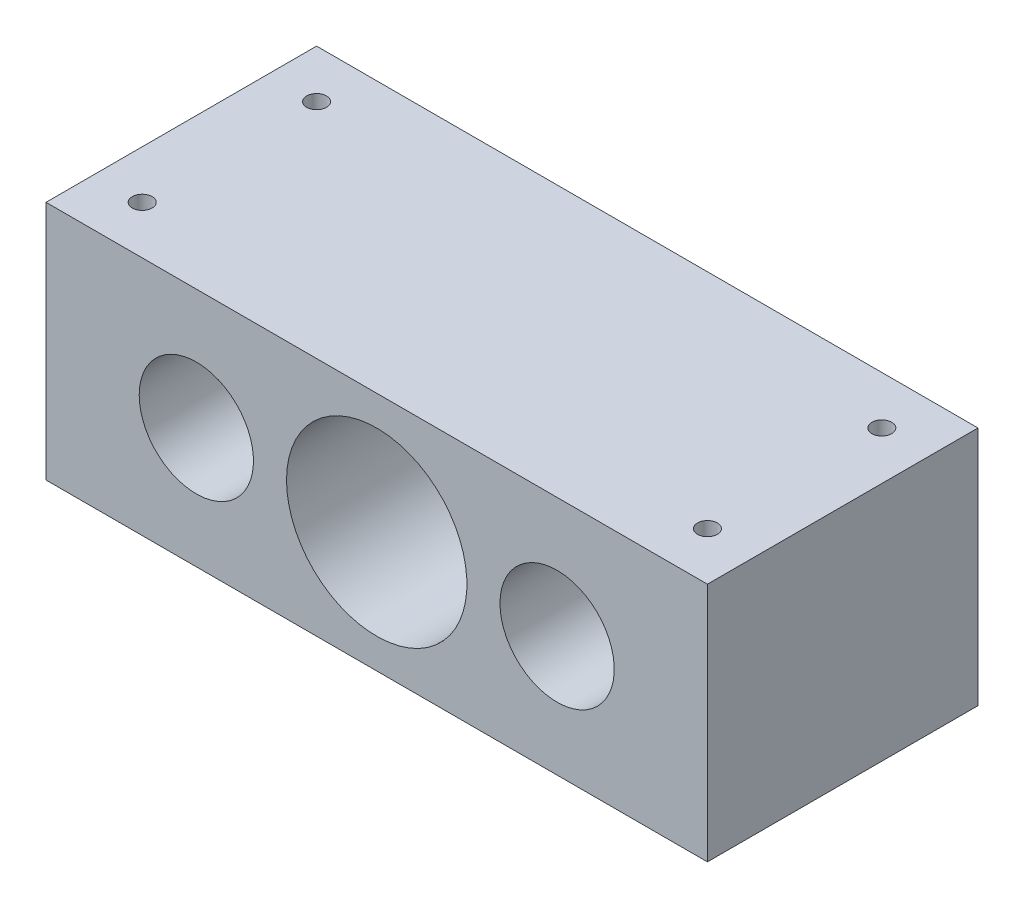
ISO-10303-21;
HEADER;
FILE_DESCRIPTION(('STEP AP214'),'2;1');
FILE_NAME('part.step','',(''),(''),'','','');
FILE_SCHEMA(('AUTOMOTIVE_DESIGN { 1 0 10303 214 1 1 1 1 }'));
ENDSEC;
DATA;
#1=APPLICATION_CONTEXT('core data for automotive mechanical design processes');
#2=APPLICATION_PROTOCOL_DEFINITION('international standard','automotive_design',2000,#1);
#3=PRODUCT_CONTEXT('',#1,'mechanical');
#4=PRODUCT('Part','Part','',(#3));
#5=PRODUCT_RELATED_PRODUCT_CATEGORY('part','',(#4));
#6=PRODUCT_DEFINITION_FORMATION('','',#4);
#7=PRODUCT_DEFINITION_CONTEXT('part definition',#1,'design');
#8=PRODUCT_DEFINITION('design','',#6,#7);
#9=PRODUCT_DEFINITION_SHAPE('','',#8);
#10=(LENGTH_UNIT() NAMED_UNIT(*) SI_UNIT(.MILLI.,.METRE.));
#11=(NAMED_UNIT(*) PLANE_ANGLE_UNIT() SI_UNIT($,.RADIAN.));
#12=(NAMED_UNIT(*) SI_UNIT($,.STERADIAN.) SOLID_ANGLE_UNIT());
#13=UNCERTAINTY_MEASURE_WITH_UNIT(LENGTH_MEASURE(1.E-05),#10,'distance_accuracy_value','');
#14=(GEOMETRIC_REPRESENTATION_CONTEXT(3) GLOBAL_UNCERTAINTY_ASSIGNED_CONTEXT((#13)) GLOBAL_UNIT_ASSIGNED_CONTEXT((#10,
#11,#12)) REPRESENTATION_CONTEXT('',''));
#15=CARTESIAN_POINT('',(0.,0.,0.));
#16=DIRECTION('',(0.,0.,1.));
#17=DIRECTION('',(1.,0.,0.));
#18=AXIS2_PLACEMENT_3D('',#15,#16,#17);
#19=CARTESIAN_POINT('',(0.,0.,22.5));
#20=DIRECTION('',(0.,1.,0.));
#21=DIRECTION('',(0.,0.,1.));
#22=AXIS2_PLACEMENT_3D('',#19,#20,#21);
#23=PLANE('',#22);
#24=DIRECTION('',(1.,0.,0.));
#25=VECTOR('',#24,1.);
#26=CARTESIAN_POINT('',(0.,0.,-22.5));
#27=LINE('',#26,#25);
#28=CARTESIAN_POINT('',(-55.,0.,-22.5));
#29=VERTEX_POINT('',#28);
#30=CARTESIAN_POINT('',(55.,0.,-22.5));
#31=VERTEX_POINT('',#30);
#32=EDGE_CURVE('E200',#29,#31,#27,.T.);
#33=ORIENTED_EDGE('',*,*,#32,.T.);
#34=DIRECTION('',(0.,0.,-1.));
#35=VECTOR('',#34,1.);
#36=CARTESIAN_POINT('',(55.,0.,22.5));
#37=LINE('',#36,#35);
#38=CARTESIAN_POINT('',(55.,0.,22.5));
#39=VERTEX_POINT('',#38);
#40=EDGE_CURVE('E13',#39,#31,#37,.T.);
#41=ORIENTED_EDGE('',*,*,#40,.F.);
#42=DIRECTION('',(1.,0.,0.));
#43=VECTOR('',#42,1.);
#44=CARTESIAN_POINT('',(0.,0.,22.5));
#45=LINE('',#44,#43);
#46=CARTESIAN_POINT('',(-55.,0.,22.5));
#47=VERTEX_POINT('',#46);
#48=EDGE_CURVE('E92',#47,#39,#45,.T.);
#49=ORIENTED_EDGE('',*,*,#48,.F.);
#50=DIRECTION('',(0.,0.,-1.));
#51=VECTOR('',#50,1.);
#52=CARTESIAN_POINT('',(-55.,0.,22.5));
#53=LINE('',#52,#51);
#54=EDGE_CURVE('E194',#47,#29,#53,.T.);
#55=ORIENTED_EDGE('',*,*,#54,.T.);
#56=EDGE_LOOP('',(#33,#41,#49,#55));
#57=FACE_BOUND('',#56,.T.);
#58=ADVANCED_FACE('F48',(#57),#23,.F.);
#59=CARTESIAN_POINT('',(55.,0.,22.5));
#60=DIRECTION('',(1.,0.,0.));
#61=DIRECTION('',(0.,0.,-1.));
#62=AXIS2_PLACEMENT_3D('',#59,#60,#61);
#63=PLANE('',#62);
#64=DIRECTION('',(0.,-1.,0.));
#65=VECTOR('',#64,1.);
#66=CARTESIAN_POINT('',(55.,0.,-22.5));
#67=LINE('',#66,#65);
#68=CARTESIAN_POINT('',(55.,40.,-22.5));
#69=VERTEX_POINT('',#68);
#70=EDGE_CURVE('E203',#69,#31,#67,.T.);
#71=ORIENTED_EDGE('',*,*,#70,.F.);
#72=DIRECTION('',(0.,0.,-1.));
#73=VECTOR('',#72,1.);
#74=CARTESIAN_POINT('',(55.,40.,22.5));
#75=LINE('',#74,#73);
#76=CARTESIAN_POINT('',(55.,40.,22.5));
#77=VERTEX_POINT('',#76);
#78=EDGE_CURVE('E57',#77,#69,#75,.T.);
#79=ORIENTED_EDGE('',*,*,#78,.F.);
#80=DIRECTION('',(0.,-1.,0.));
#81=VECTOR('',#80,1.);
#82=CARTESIAN_POINT('',(55.,0.,22.5));
#83=LINE('',#82,#81);
#84=EDGE_CURVE('E185',#77,#39,#83,.T.);
#85=ORIENTED_EDGE('',*,*,#84,.T.);
#86=ORIENTED_EDGE('',*,*,#40,.T.);
#87=EDGE_LOOP('',(#71,#79,#85,#86));
#88=FACE_BOUND('',#87,.T.);
#89=ADVANCED_FACE('F220',(#88),#63,.T.);
#90=CARTESIAN_POINT('',(0.,40.,22.5));
#91=DIRECTION('',(0.,-1.,0.));
#92=DIRECTION('',(0.,0.,-1.));
#93=AXIS2_PLACEMENT_3D('',#90,#91,#92);
#94=PLANE('',#93);
#95=CARTESIAN_POINT('',(47.,40.,-14.5));
#96=DIRECTION('',(0.,1.,0.));
#97=DIRECTION('',(0.,0.,1.));
#98=AXIS2_PLACEMENT_3D('',#95,#96,#97);
#99=CIRCLE('',#98,1.65);
#100=CARTESIAN_POINT('',(47.,40.,-12.85));
#101=VERTEX_POINT('',#100);
#102=EDGE_CURVE('E130',#101,#101,#99,.T.);
#103=ORIENTED_EDGE('',*,*,#102,.F.);
#104=EDGE_LOOP('',(#103));
#105=FACE_BOUND('',#104,.T.);
#106=CARTESIAN_POINT('',(-47.,40.,-14.4999999999993));
#107=DIRECTION('',(0.,1.,0.));
#108=DIRECTION('',(0.,0.,1.));
#109=AXIS2_PLACEMENT_3D('',#106,#107,#108);
#110=CIRCLE('',#109,1.65);
#111=CARTESIAN_POINT('',(-47.,40.,-12.8499999999993));
#112=VERTEX_POINT('',#111);
#113=EDGE_CURVE('E129',#112,#112,#110,.T.);
#114=ORIENTED_EDGE('',*,*,#113,.F.);
#115=EDGE_LOOP('',(#114));
#116=FACE_BOUND('',#115,.T.);
#117=CARTESIAN_POINT('',(-46.9999999999997,40.,14.5000000000007));
#118=DIRECTION('',(0.,1.,0.));
#119=DIRECTION('',(0.,0.,1.));
#120=AXIS2_PLACEMENT_3D('',#117,#118,#119);
#121=CIRCLE('',#120,1.65);
#122=CARTESIAN_POINT('',(-46.9999999999997,40.,16.1500000000007));
#123=VERTEX_POINT('',#122);
#124=EDGE_CURVE('E140',#123,#123,#121,.T.);
#125=ORIENTED_EDGE('',*,*,#124,.F.);
#126=EDGE_LOOP('',(#125));
#127=FACE_BOUND('',#126,.T.);
#128=CARTESIAN_POINT('',(47.0000000000003,40.,14.5));
#129=DIRECTION('',(0.,1.,0.));
#130=DIRECTION('',(0.,0.,1.));
#131=AXIS2_PLACEMENT_3D('',#128,#129,#130);
#132=CIRCLE('',#131,1.65);
#133=CARTESIAN_POINT('',(47.0000000000003,40.,16.15));
#134=VERTEX_POINT('',#133);
#135=EDGE_CURVE('E146',#134,#134,#132,.T.);
#136=ORIENTED_EDGE('',*,*,#135,.F.);
#137=EDGE_LOOP('',(#136));
#138=FACE_BOUND('',#137,.T.);
#139=DIRECTION('',(-1.,0.,0.));
#140=VECTOR('',#139,1.);
#141=CARTESIAN_POINT('',(0.,40.,-22.5));
#142=LINE('',#141,#140);
#143=CARTESIAN_POINT('',(-55.,40.,-22.5));
#144=VERTEX_POINT('',#143);
#145=EDGE_CURVE('E81',#69,#144,#142,.T.);
#146=ORIENTED_EDGE('',*,*,#145,.T.);
#147=DIRECTION('',(0.,0.,-1.));
#148=VECTOR('',#147,1.);
#149=CARTESIAN_POINT('',(-55.,40.,22.5));
#150=LINE('',#149,#148);
#151=CARTESIAN_POINT('',(-55.,40.,22.5));
#152=VERTEX_POINT('',#151);
#153=EDGE_CURVE('E211',#152,#144,#150,.T.);
#154=ORIENTED_EDGE('',*,*,#153,.F.);
#155=DIRECTION('',(-1.,0.,0.));
#156=VECTOR('',#155,1.);
#157=CARTESIAN_POINT('',(0.,40.,22.5));
#158=LINE('',#157,#156);
#159=EDGE_CURVE('E188',#77,#152,#158,.T.);
#160=ORIENTED_EDGE('',*,*,#159,.F.);
#161=ORIENTED_EDGE('',*,*,#78,.T.);
#162=EDGE_LOOP('',(#146,#154,#160,#161));
#163=FACE_BOUND('',#162,.T.);
#164=ADVANCED_FACE('F213',(#105,#116,#127,#138,#163),#94,.F.);
#165=CARTESIAN_POINT('',(-55.,0.,22.5));
#166=DIRECTION('',(1.,0.,0.));
#167=DIRECTION('',(0.,0.,-1.));
#168=AXIS2_PLACEMENT_3D('',#165,#166,#167);
#169=PLANE('',#168);
#170=DIRECTION('',(0.,-1.,0.));
#171=VECTOR('',#170,1.);
#172=CARTESIAN_POINT('',(-55.,0.,-22.5));
#173=LINE('',#172,#171);
#174=EDGE_CURVE('E87',#144,#29,#173,.T.);
#175=ORIENTED_EDGE('',*,*,#174,.T.);
#176=ORIENTED_EDGE('',*,*,#54,.F.);
#177=DIRECTION('',(0.,-1.,0.));
#178=VECTOR('',#177,1.);
#179=CARTESIAN_POINT('',(-55.,0.,22.5));
#180=LINE('',#179,#178);
#181=EDGE_CURVE('E65',#152,#47,#180,.T.);
#182=ORIENTED_EDGE('',*,*,#181,.F.);
#183=ORIENTED_EDGE('',*,*,#153,.T.);
#184=EDGE_LOOP('',(#175,#176,#182,#183));
#185=FACE_BOUND('',#184,.T.);
#186=ADVANCED_FACE('F222',(#185),#169,.F.);
#187=CARTESIAN_POINT('',(-30.,20.,22.5));
#188=DIRECTION('',(0.,0.,-1.));
#189=DIRECTION('',(-1.,0.,0.));
#190=AXIS2_PLACEMENT_3D('',#187,#188,#189);
#191=CYLINDRICAL_SURFACE('',#190,9.5);
#192=CARTESIAN_POINT('',(-30.,20.,22.5));
#193=DIRECTION('',(0.,0.,1.));
#194=DIRECTION('',(1.,0.,0.));
#195=AXIS2_PLACEMENT_3D('',#192,#193,#194);
#196=CIRCLE('',#195,9.5);
#197=CARTESIAN_POINT('',(-39.5,20.,22.5));
#198=VERTEX_POINT('',#197);
#199=EDGE_CURVE('E180',#198,#198,#196,.T.);
#200=CARTESIAN_POINT('',(-30.,20.,-22.5));
#201=DIRECTION('',(0.,0.,1.));
#202=DIRECTION('',(1.,0.,0.));
#203=AXIS2_PLACEMENT_3D('',#200,#201,#202);
#204=CIRCLE('',#203,9.5);
#205=CARTESIAN_POINT('',(-39.5,20.,-22.5));
#206=VERTEX_POINT('',#205);
#207=EDGE_CURVE('E197',#206,#206,#204,.T.);
#208=CARTESIAN_POINT('',(-39.5,20.,22.5));
#209=CARTESIAN_POINT('',(-39.5,20.,22.03125));
#210=CARTESIAN_POINT('',(-39.5,20.,21.5625));
#211=CARTESIAN_POINT('',(-39.5,20.,20.625));
#212=CARTESIAN_POINT('',(-39.5,20.,20.15625));
#213=CARTESIAN_POINT('',(-39.5,20.,19.21875));
#214=CARTESIAN_POINT('',(-39.5,20.,18.75));
#215=CARTESIAN_POINT('',(-39.5,20.,17.8125));
#216=CARTESIAN_POINT('',(-39.5,20.,17.34375));
#217=CARTESIAN_POINT('',(-39.5,20.,16.40625));
#218=CARTESIAN_POINT('',(-39.5,20.,15.9375));
#219=CARTESIAN_POINT('',(-39.5,20.,15.));
#220=CARTESIAN_POINT('',(-39.5,20.,14.53125));
#221=CARTESIAN_POINT('',(-39.5,20.,13.59375));
#222=CARTESIAN_POINT('',(-39.5,20.,13.125));
#223=CARTESIAN_POINT('',(-39.5,20.,12.1875));
#224=CARTESIAN_POINT('',(-39.5,20.,11.71875));
#225=CARTESIAN_POINT('',(-39.5,20.,10.78125));
#226=CARTESIAN_POINT('',(-39.5,20.,10.3125));
#227=CARTESIAN_POINT('',(-39.5,20.,9.37499999999999));
#228=CARTESIAN_POINT('',(-39.5,20.,8.90625));
#229=CARTESIAN_POINT('',(-39.5,20.,7.96874999999999));
#230=CARTESIAN_POINT('',(-39.5,20.,7.5));
#231=CARTESIAN_POINT('',(-39.5,20.,6.5625));
#232=CARTESIAN_POINT('',(-39.5,20.,6.09375));
#233=CARTESIAN_POINT('',(-39.5,20.,5.15625));
#234=CARTESIAN_POINT('',(-39.5,20.,4.6875));
#235=CARTESIAN_POINT('',(-39.5,20.,3.75));
#236=CARTESIAN_POINT('',(-39.5,20.,3.28125));
#237=CARTESIAN_POINT('',(-39.5,20.,2.34375));
#238=CARTESIAN_POINT('',(-39.5,20.,1.875));
#239=CARTESIAN_POINT('',(-39.5,20.,0.937499999999997));
#240=CARTESIAN_POINT('',(-39.5,20.,0.468749999999997));
#241=CARTESIAN_POINT('',(-39.5,20.,-0.468750000000004));
#242=CARTESIAN_POINT('',(-39.5,20.,-0.937500000000004));
#243=CARTESIAN_POINT('',(-39.5,20.,-1.87500000000001));
#244=CARTESIAN_POINT('',(-39.5,20.,-2.34375000000001));
#245=CARTESIAN_POINT('',(-39.5,20.,-3.28125));
#246=CARTESIAN_POINT('',(-39.5,20.,-3.75));
#247=CARTESIAN_POINT('',(-39.5,20.,-4.6875));
#248=CARTESIAN_POINT('',(-39.5,20.,-5.15625));
#249=CARTESIAN_POINT('',(-39.5,20.,-6.09375000000001));
#250=CARTESIAN_POINT('',(-39.5,20.,-6.56250000000001));
#251=CARTESIAN_POINT('',(-39.5,20.,-7.50000000000001));
#252=CARTESIAN_POINT('',(-39.5,20.,-7.96875000000001));
#253=CARTESIAN_POINT('',(-39.5,20.,-8.90625));
#254=CARTESIAN_POINT('',(-39.5,20.,-9.37500000000001));
#255=CARTESIAN_POINT('',(-39.5,20.,-10.3125));
#256=CARTESIAN_POINT('',(-39.5,20.,-10.78125));
#257=CARTESIAN_POINT('',(-39.5,20.,-11.71875));
#258=CARTESIAN_POINT('',(-39.5,20.,-12.1875));
#259=CARTESIAN_POINT('',(-39.5,20.,-13.125));
#260=CARTESIAN_POINT('',(-39.5,20.,-13.59375));
#261=CARTESIAN_POINT('',(-39.5,20.,-14.53125));
#262=CARTESIAN_POINT('',(-39.5,20.,-15.));
#263=CARTESIAN_POINT('',(-39.5,20.,-15.9375));
#264=CARTESIAN_POINT('',(-39.5,20.,-16.40625));
#265=CARTESIAN_POINT('',(-39.5,20.,-17.34375));
#266=CARTESIAN_POINT('',(-39.5,20.,-17.8125));
#267=CARTESIAN_POINT('',(-39.5,20.,-18.75));
#268=CARTESIAN_POINT('',(-39.5,20.,-19.21875));
#269=CARTESIAN_POINT('',(-39.5,20.,-20.15625));
#270=CARTESIAN_POINT('',(-39.5,20.,-20.625));
#271=CARTESIAN_POINT('',(-39.5,20.,-21.5625));
#272=CARTESIAN_POINT('',(-39.5,20.,-22.03125));
#273=CARTESIAN_POINT('',(-39.5,20.,-22.5));
#274=B_SPLINE_CURVE_WITH_KNOTS('',3,(#208,#209,#210,#211,#212,#213,#214,#215,#216,#217,#218,
#219,#220,#221,#222,#223,#224,#225,#226,#227,#228,#229,#230,#231,#232,#233,#234,#235,#236,#237,
#238,#239,#240,#241,#242,#243,#244,#245,#246,#247,#248,#249,#250,#251,#252,#253,#254,#255,#256,
#257,#258,#259,#260,#261,#262,#263,#264,#265,#266,#267,#268,#269,#270,#271,#272,#273),
.UNSPECIFIED.,.F.,.F.,(4,2,2,2,2,2,2,2,2,2,2,2,2,2,2,2,2,2,2,2,2,2,2,2,2,2,2,2,2,2,2,2,4),(0.,
1.40625,2.8125,4.21875,5.625,7.03125,8.4375,9.84375,11.25,12.65625,14.0625,15.46875,16.875,
18.28125,19.6875,21.09375,22.5,23.90625,25.3125,26.71875,28.125,29.53125,30.9375,32.34375,33.75,
35.15625,36.5625,37.96875,39.375,40.78125,42.1875,43.59375,45.),.UNSPECIFIED.);
#275=EDGE_CURVE('BSEAM224',#198,#206,#274,.T.);
#276=ORIENTED_EDGE('',*,*,#199,.T.);
#277=ORIENTED_EDGE('',*,*,#207,.F.);
#278=ORIENTED_EDGE('',*,*,#275,.T.);
#279=ORIENTED_EDGE('',*,*,#275,.F.);
#280=EDGE_LOOP('',(#276,#278,#277,#279));
#281=FACE_BOUND('',#280,.T.);
#282=ADVANCED_FACE('F224',(#281),#191,.F.);
#283=CARTESIAN_POINT('',(0.,20.,22.5));
#284=DIRECTION('',(0.,0.,-1.));
#285=DIRECTION('',(-1.,0.,0.));
#286=AXIS2_PLACEMENT_3D('',#283,#284,#285);
#287=CYLINDRICAL_SURFACE('',#286,15.);
#288=CARTESIAN_POINT('',(0.,20.,22.5));
#289=DIRECTION('',(0.,0.,1.));
#290=DIRECTION('',(1.,0.,0.));
#291=AXIS2_PLACEMENT_3D('',#288,#289,#290);
#292=CIRCLE('',#291,15.);
#293=CARTESIAN_POINT('',(-15.,20.,22.5));
#294=VERTEX_POINT('',#293);
#295=EDGE_CURVE('E177',#294,#294,#292,.T.);
#296=CARTESIAN_POINT('',(0.,20.,-22.5));
#297=DIRECTION('',(0.,0.,1.));
#298=DIRECTION('',(1.,0.,0.));
#299=AXIS2_PLACEMENT_3D('',#296,#297,#298);
#300=CIRCLE('',#299,15.);
#301=CARTESIAN_POINT('',(-15.,20.,-22.5));
#302=VERTEX_POINT('',#301);
#303=EDGE_CURVE('E176',#302,#302,#300,.T.);
#304=CARTESIAN_POINT('',(-15.,20.,22.5));
#305=CARTESIAN_POINT('',(-15.,20.,22.03125));
#306=CARTESIAN_POINT('',(-15.,20.,21.5625));
#307=CARTESIAN_POINT('',(-15.,20.,20.625));
#308=CARTESIAN_POINT('',(-15.,20.,20.15625));
#309=CARTESIAN_POINT('',(-15.,20.,19.21875));
#310=CARTESIAN_POINT('',(-15.,20.,18.75));
#311=CARTESIAN_POINT('',(-15.,20.,17.8125));
#312=CARTESIAN_POINT('',(-15.,20.,17.34375));
#313=CARTESIAN_POINT('',(-15.,20.,16.40625));
#314=CARTESIAN_POINT('',(-15.,20.,15.9375));
#315=CARTESIAN_POINT('',(-15.,20.,15.));
#316=CARTESIAN_POINT('',(-15.,20.,14.53125));
#317=CARTESIAN_POINT('',(-15.,20.,13.59375));
#318=CARTESIAN_POINT('',(-15.,20.,13.125));
#319=CARTESIAN_POINT('',(-15.,20.,12.1875));
#320=CARTESIAN_POINT('',(-15.,20.,11.71875));
#321=CARTESIAN_POINT('',(-15.,20.,10.78125));
#322=CARTESIAN_POINT('',(-15.,20.,10.3125));
#323=CARTESIAN_POINT('',(-15.,20.,9.37499999999999));
#324=CARTESIAN_POINT('',(-15.,20.,8.90625));
#325=CARTESIAN_POINT('',(-15.,20.,7.96874999999999));
#326=CARTESIAN_POINT('',(-15.,20.,7.5));
#327=CARTESIAN_POINT('',(-15.,20.,6.5625));
#328=CARTESIAN_POINT('',(-15.,20.,6.09375));
#329=CARTESIAN_POINT('',(-15.,20.,5.15625));
#330=CARTESIAN_POINT('',(-15.,20.,4.6875));
#331=CARTESIAN_POINT('',(-15.,20.,3.75));
#332=CARTESIAN_POINT('',(-15.,20.,3.28125));
#333=CARTESIAN_POINT('',(-15.,20.,2.34375));
#334=CARTESIAN_POINT('',(-15.,20.,1.875));
#335=CARTESIAN_POINT('',(-15.,20.,0.937499999999997));
#336=CARTESIAN_POINT('',(-15.,20.,0.468749999999997));
#337=CARTESIAN_POINT('',(-15.,20.,-0.468750000000004));
#338=CARTESIAN_POINT('',(-15.,20.,-0.937500000000004));
#339=CARTESIAN_POINT('',(-15.,20.,-1.87500000000001));
#340=CARTESIAN_POINT('',(-15.,20.,-2.34375000000001));
#341=CARTESIAN_POINT('',(-15.,20.,-3.28125));
#342=CARTESIAN_POINT('',(-15.,20.,-3.75));
#343=CARTESIAN_POINT('',(-15.,20.,-4.6875));
#344=CARTESIAN_POINT('',(-15.,20.,-5.15625));
#345=CARTESIAN_POINT('',(-15.,20.,-6.09375000000001));
#346=CARTESIAN_POINT('',(-15.,20.,-6.56250000000001));
#347=CARTESIAN_POINT('',(-15.,20.,-7.50000000000001));
#348=CARTESIAN_POINT('',(-15.,20.,-7.96875000000001));
#349=CARTESIAN_POINT('',(-15.,20.,-8.90625));
#350=CARTESIAN_POINT('',(-15.,20.,-9.37500000000001));
#351=CARTESIAN_POINT('',(-15.,20.,-10.3125));
#352=CARTESIAN_POINT('',(-15.,20.,-10.78125));
#353=CARTESIAN_POINT('',(-15.,20.,-11.71875));
#354=CARTESIAN_POINT('',(-15.,20.,-12.1875));
#355=CARTESIAN_POINT('',(-15.,20.,-13.125));
#356=CARTESIAN_POINT('',(-15.,20.,-13.59375));
#357=CARTESIAN_POINT('',(-15.,20.,-14.53125));
#358=CARTESIAN_POINT('',(-15.,20.,-15.));
#359=CARTESIAN_POINT('',(-15.,20.,-15.9375));
#360=CARTESIAN_POINT('',(-15.,20.,-16.40625));
#361=CARTESIAN_POINT('',(-15.,20.,-17.34375));
#362=CARTESIAN_POINT('',(-15.,20.,-17.8125));
#363=CARTESIAN_POINT('',(-15.,20.,-18.75));
#364=CARTESIAN_POINT('',(-15.,20.,-19.21875));
#365=CARTESIAN_POINT('',(-15.,20.,-20.15625));
#366=CARTESIAN_POINT('',(-15.,20.,-20.625));
#367=CARTESIAN_POINT('',(-15.,20.,-21.5625));
#368=CARTESIAN_POINT('',(-15.,20.,-22.03125));
#369=CARTESIAN_POINT('',(-15.,20.,-22.5));
#370=B_SPLINE_CURVE_WITH_KNOTS('',3,(#304,#305,#306,#307,#308,#309,#310,#311,#312,#313,#314,
#315,#316,#317,#318,#319,#320,#321,#322,#323,#324,#325,#326,#327,#328,#329,#330,#331,#332,#333,
#334,#335,#336,#337,#338,#339,#340,#341,#342,#343,#344,#345,#346,#347,#348,#349,#350,#351,#352,
#353,#354,#355,#356,#357,#358,#359,#360,#361,#362,#363,#364,#365,#366,#367,#368,#369),
.UNSPECIFIED.,.F.,.F.,(4,2,2,2,2,2,2,2,2,2,2,2,2,2,2,2,2,2,2,2,2,2,2,2,2,2,2,2,2,2,2,2,4),(0.,
1.40625,2.8125,4.21875,5.625,7.03125,8.4375,9.84375,11.25,12.65625,14.0625,15.46875,16.875,
18.28125,19.6875,21.09375,22.5,23.90625,25.3125,26.71875,28.125,29.53125,30.9375,32.34375,33.75,
35.15625,36.5625,37.96875,39.375,40.78125,42.1875,43.59375,45.),.UNSPECIFIED.);
#371=EDGE_CURVE('BSEAM50',#294,#302,#370,.T.);
#372=ORIENTED_EDGE('',*,*,#295,.T.);
#373=ORIENTED_EDGE('',*,*,#303,.F.);
#374=ORIENTED_EDGE('',*,*,#371,.T.);
#375=ORIENTED_EDGE('',*,*,#371,.F.);
#376=EDGE_LOOP('',(#372,#374,#373,#375));
#377=FACE_BOUND('',#376,.T.);
#378=ADVANCED_FACE('F50',(#377),#287,.F.);
#379=CARTESIAN_POINT('',(30.,20.,22.5));
#380=DIRECTION('',(0.,0.,-1.));
#381=DIRECTION('',(-1.,0.,0.));
#382=AXIS2_PLACEMENT_3D('',#379,#380,#381);
#383=CYLINDRICAL_SURFACE('',#382,9.50000000000001);
#384=CARTESIAN_POINT('',(30.,20.,22.5));
#385=DIRECTION('',(0.,0.,1.));
#386=DIRECTION('',(1.,0.,0.));
#387=AXIS2_PLACEMENT_3D('',#384,#385,#386);
#388=CIRCLE('',#387,9.50000000000001);
#389=CARTESIAN_POINT('',(20.5,20.,22.5));
#390=VERTEX_POINT('',#389);
#391=EDGE_CURVE('E191',#390,#390,#388,.F.);
#392=CARTESIAN_POINT('',(30.,20.,-22.5));
#393=DIRECTION('',(0.,0.,1.));
#394=DIRECTION('',(1.,0.,0.));
#395=AXIS2_PLACEMENT_3D('',#392,#393,#394);
#396=CIRCLE('',#395,9.50000000000001);
#397=CARTESIAN_POINT('',(20.5,20.,-22.5));
#398=VERTEX_POINT('',#397);
#399=EDGE_CURVE('E181',#398,#398,#396,.F.);
#400=CARTESIAN_POINT('',(20.5,20.,22.5));
#401=CARTESIAN_POINT('',(20.5,20.,22.03125));
#402=CARTESIAN_POINT('',(20.5,20.,21.5625));
#403=CARTESIAN_POINT('',(20.5,20.,20.625));
#404=CARTESIAN_POINT('',(20.5,20.,20.15625));
#405=CARTESIAN_POINT('',(20.5,20.,19.21875));
#406=CARTESIAN_POINT('',(20.5,20.,18.75));
#407=CARTESIAN_POINT('',(20.5,20.,17.8125));
#408=CARTESIAN_POINT('',(20.5,20.,17.34375));
#409=CARTESIAN_POINT('',(20.5,20.,16.40625));
#410=CARTESIAN_POINT('',(20.5,20.,15.9375));
#411=CARTESIAN_POINT('',(20.5,20.,15.));
#412=CARTESIAN_POINT('',(20.5,20.,14.53125));
#413=CARTESIAN_POINT('',(20.5,20.,13.59375));
#414=CARTESIAN_POINT('',(20.5,20.,13.125));
#415=CARTESIAN_POINT('',(20.5,20.,12.1875));
#416=CARTESIAN_POINT('',(20.5,20.,11.71875));
#417=CARTESIAN_POINT('',(20.5,20.,10.78125));
#418=CARTESIAN_POINT('',(20.5,20.,10.3125));
#419=CARTESIAN_POINT('',(20.5,20.,9.37499999999999));
#420=CARTESIAN_POINT('',(20.5,20.,8.90625));
#421=CARTESIAN_POINT('',(20.5,20.,7.96874999999999));
#422=CARTESIAN_POINT('',(20.5,20.,7.5));
#423=CARTESIAN_POINT('',(20.5,20.,6.5625));
#424=CARTESIAN_POINT('',(20.5,20.,6.09375));
#425=CARTESIAN_POINT('',(20.5,20.,5.15625));
#426=CARTESIAN_POINT('',(20.5,20.,4.6875));
#427=CARTESIAN_POINT('',(20.5,20.,3.75));
#428=CARTESIAN_POINT('',(20.5,20.,3.28125));
#429=CARTESIAN_POINT('',(20.5,20.,2.34375));
#430=CARTESIAN_POINT('',(20.5,20.,1.875));
#431=CARTESIAN_POINT('',(20.5,20.,0.937499999999997));
#432=CARTESIAN_POINT('',(20.5,20.,0.468749999999997));
#433=CARTESIAN_POINT('',(20.5,20.,-0.468750000000004));
#434=CARTESIAN_POINT('',(20.5,20.,-0.937500000000004));
#435=CARTESIAN_POINT('',(20.5,20.,-1.87500000000001));
#436=CARTESIAN_POINT('',(20.5,20.,-2.34375000000001));
#437=CARTESIAN_POINT('',(20.5,20.,-3.28125));
#438=CARTESIAN_POINT('',(20.5,20.,-3.75));
#439=CARTESIAN_POINT('',(20.5,20.,-4.6875));
#440=CARTESIAN_POINT('',(20.5,20.,-5.15625));
#441=CARTESIAN_POINT('',(20.5,20.,-6.09375000000001));
#442=CARTESIAN_POINT('',(20.5,20.,-6.56250000000001));
#443=CARTESIAN_POINT('',(20.5,20.,-7.50000000000001));
#444=CARTESIAN_POINT('',(20.5,20.,-7.96875000000001));
#445=CARTESIAN_POINT('',(20.5,20.,-8.90625));
#446=CARTESIAN_POINT('',(20.5,20.,-9.37500000000001));
#447=CARTESIAN_POINT('',(20.5,20.,-10.3125));
#448=CARTESIAN_POINT('',(20.5,20.,-10.78125));
#449=CARTESIAN_POINT('',(20.5,20.,-11.71875));
#450=CARTESIAN_POINT('',(20.5,20.,-12.1875));
#451=CARTESIAN_POINT('',(20.5,20.,-13.125));
#452=CARTESIAN_POINT('',(20.5,20.,-13.59375));
#453=CARTESIAN_POINT('',(20.5,20.,-14.53125));
#454=CARTESIAN_POINT('',(20.5,20.,-15.));
#455=CARTESIAN_POINT('',(20.5,20.,-15.9375));
#456=CARTESIAN_POINT('',(20.5,20.,-16.40625));
#457=CARTESIAN_POINT('',(20.5,20.,-17.34375));
#458=CARTESIAN_POINT('',(20.5,20.,-17.8125));
#459=CARTESIAN_POINT('',(20.5,20.,-18.75));
#460=CARTESIAN_POINT('',(20.5,20.,-19.21875));
#461=CARTESIAN_POINT('',(20.5,20.,-20.15625));
#462=CARTESIAN_POINT('',(20.5,20.,-20.625));
#463=CARTESIAN_POINT('',(20.5,20.,-21.5625));
#464=CARTESIAN_POINT('',(20.5,20.,-22.03125));
#465=CARTESIAN_POINT('',(20.5,20.,-22.5));
#466=B_SPLINE_CURVE_WITH_KNOTS('',3,(#400,#401,#402,#403,#404,#405,#406,#407,#408,#409,#410,
#411,#412,#413,#414,#415,#416,#417,#418,#419,#420,#421,#422,#423,#424,#425,#426,#427,#428,#429,
#430,#431,#432,#433,#434,#435,#436,#437,#438,#439,#440,#441,#442,#443,#444,#445,#446,#447,#448,
#449,#450,#451,#452,#453,#454,#455,#456,#457,#458,#459,#460,#461,#462,#463,#464,#465),
.UNSPECIFIED.,.F.,.F.,(4,2,2,2,2,2,2,2,2,2,2,2,2,2,2,2,2,2,2,2,2,2,2,2,2,2,2,2,2,2,2,2,4),(0.,
1.40625,2.8125,4.21875,5.625,7.03125,8.4375,9.84375,11.25,12.65625,14.0625,15.46875,16.875,
18.28125,19.6875,21.09375,22.5,23.90625,25.3125,26.71875,28.125,29.53125,30.9375,32.34375,33.75,
35.15625,36.5625,37.96875,39.375,40.78125,42.1875,43.59375,45.),.UNSPECIFIED.);
#467=EDGE_CURVE('BSEAM437',#390,#398,#466,.T.);
#468=ORIENTED_EDGE('',*,*,#391,.F.);
#469=ORIENTED_EDGE('',*,*,#399,.T.);
#470=ORIENTED_EDGE('',*,*,#467,.T.);
#471=ORIENTED_EDGE('',*,*,#467,.F.);
#472=EDGE_LOOP('',(#468,#470,#469,#471));
#473=FACE_BOUND('',#472,.T.);
#474=ADVANCED_FACE('F437',(#473),#383,.F.);
#475=CARTESIAN_POINT('',(0.,0.,22.5));
#476=DIRECTION('',(0.,0.,1.));
#477=DIRECTION('',(1.,0.,0.));
#478=AXIS2_PLACEMENT_3D('',#475,#476,#477);
#479=PLANE('',#478);
#480=ORIENTED_EDGE('',*,*,#295,.F.);
#481=EDGE_LOOP('',(#480));
#482=FACE_BOUND('',#481,.T.);
#483=ORIENTED_EDGE('',*,*,#199,.F.);
#484=EDGE_LOOP('',(#483));
#485=FACE_BOUND('',#484,.T.);
#486=ORIENTED_EDGE('',*,*,#48,.T.);
#487=ORIENTED_EDGE('',*,*,#84,.F.);
#488=ORIENTED_EDGE('',*,*,#159,.T.);
#489=ORIENTED_EDGE('',*,*,#181,.T.);
#490=EDGE_LOOP('',(#486,#487,#488,#489));
#491=FACE_BOUND('',#490,.T.);
#492=ORIENTED_EDGE('',*,*,#391,.T.);
#493=EDGE_LOOP('',(#492));
#494=FACE_BOUND('',#493,.T.);
#495=ADVANCED_FACE('F434',(#482,#485,#491,#494),#479,.T.);
#496=CARTESIAN_POINT('',(0.,0.,-22.5));
#497=DIRECTION('',(0.,0.,1.));
#498=DIRECTION('',(1.,0.,0.));
#499=AXIS2_PLACEMENT_3D('',#496,#497,#498);
#500=PLANE('',#499);
#501=CARTESIAN_POINT('',(-11.9999999999992,32.,-22.5));
#502=DIRECTION('',(0.,0.,-1.));
#503=DIRECTION('',(-1.,0.,0.));
#504=AXIS2_PLACEMENT_3D('',#501,#502,#503);
#505=CIRCLE('',#504,1.64999999999999);
#506=CARTESIAN_POINT('',(-13.6499999999992,32.,-22.5));
#507=VERTEX_POINT('',#506);
#508=EDGE_CURVE('E152',#507,#507,#505,.T.);
#509=ORIENTED_EDGE('',*,*,#508,.F.);
#510=EDGE_LOOP('',(#509));
#511=FACE_BOUND('',#510,.T.);
#512=CARTESIAN_POINT('',(12.0000000000008,31.9999999999992,-22.5));
#513=DIRECTION('',(0.,0.,-1.));
#514=DIRECTION('',(-1.,0.,0.));
#515=AXIS2_PLACEMENT_3D('',#512,#513,#514);
#516=CIRCLE('',#515,1.64999999999999);
#517=CARTESIAN_POINT('',(10.3500000000008,31.9999999999992,-22.5));
#518=VERTEX_POINT('',#517);
#519=EDGE_CURVE('E158',#518,#518,#516,.T.);
#520=ORIENTED_EDGE('',*,*,#519,.F.);
#521=EDGE_LOOP('',(#520));
#522=FACE_BOUND('',#521,.T.);
#523=CARTESIAN_POINT('',(-12.,8.00000000000001,-22.5));
#524=DIRECTION('',(0.,0.,-1.));
#525=DIRECTION('',(-1.,0.,0.));
#526=AXIS2_PLACEMENT_3D('',#523,#524,#525);
#527=CIRCLE('',#526,1.64999999999999);
#528=CARTESIAN_POINT('',(-13.65,8.00000000000001,-22.5));
#529=VERTEX_POINT('',#528);
#530=EDGE_CURVE('E164',#529,#529,#527,.T.);
#531=ORIENTED_EDGE('',*,*,#530,.F.);
#532=EDGE_LOOP('',(#531));
#533=FACE_BOUND('',#532,.T.);
#534=CARTESIAN_POINT('',(12.,7.99999999999925,-22.5));
#535=DIRECTION('',(0.,0.,-1.));
#536=DIRECTION('',(-1.,0.,0.));
#537=AXIS2_PLACEMENT_3D('',#534,#535,#536);
#538=CIRCLE('',#537,1.64999999999999);
#539=CARTESIAN_POINT('',(10.35,7.99999999999925,-22.5));
#540=VERTEX_POINT('',#539);
#541=EDGE_CURVE('E170',#540,#540,#538,.T.);
#542=ORIENTED_EDGE('',*,*,#541,.F.);
#543=EDGE_LOOP('',(#542));
#544=FACE_BOUND('',#543,.T.);
#545=ORIENTED_EDGE('',*,*,#303,.T.);
#546=EDGE_LOOP('',(#545));
#547=FACE_BOUND('',#546,.T.);
#548=ORIENTED_EDGE('',*,*,#207,.T.);
#549=EDGE_LOOP('',(#548));
#550=FACE_BOUND('',#549,.T.);
#551=ORIENTED_EDGE('',*,*,#32,.F.);
#552=ORIENTED_EDGE('',*,*,#174,.F.);
#553=ORIENTED_EDGE('',*,*,#145,.F.);
#554=ORIENTED_EDGE('',*,*,#70,.T.);
#555=EDGE_LOOP('',(#551,#552,#553,#554));
#556=FACE_BOUND('',#555,.T.);
#557=ORIENTED_EDGE('',*,*,#399,.F.);
#558=EDGE_LOOP('',(#557));
#559=FACE_BOUND('',#558,.T.);
#560=ADVANCED_FACE('F218',(#511,#522,#533,#544,#547,#550,#556,#559),#500,.F.);
#561=CARTESIAN_POINT('',(12.,7.99999999999925,-12.4));
#562=DIRECTION('',(0.,0.,-1.));
#563=DIRECTION('',(-1.,0.,0.));
#564=AXIS2_PLACEMENT_3D('',#561,#562,#563);
#565=CONICAL_SURFACE('',#564,1.64999999999999,1.02974425867665);
#566=CARTESIAN_POINT('',(12.,7.99999999999925,-11.4085799786045));
#567=VERTEX_POINT('',#566);
#568=VERTEX_LOOP('',#567);
#569=FACE_BOUND('',#568,.T.);
#570=CARTESIAN_POINT('',(12.,7.99999999999925,-12.4));
#571=DIRECTION('',(0.,0.,-1.));
#572=DIRECTION('',(-1.,0.,0.));
#573=AXIS2_PLACEMENT_3D('',#570,#571,#572);
#574=CIRCLE('',#573,1.64999999999999);
#575=CARTESIAN_POINT('',(10.35,7.99999999999925,-12.4));
#576=VERTEX_POINT('',#575);
#577=EDGE_CURVE('E173',#576,#576,#574,.T.);
#578=ORIENTED_EDGE('',*,*,#577,.T.);
#579=EDGE_LOOP('',(#578));
#580=FACE_BOUND('',#579,.T.);
#581=ADVANCED_FACE('F385',(#569,#580),#565,.F.);
#582=CARTESIAN_POINT('',(12.,7.99999999999925,-22.5));
#583=DIRECTION('',(0.,0.,-1.));
#584=DIRECTION('',(-1.,0.,0.));
#585=AXIS2_PLACEMENT_3D('',#582,#583,#584);
#586=CYLINDRICAL_SURFACE('',#585,1.64999999999999);
#587=ORIENTED_EDGE('',*,*,#577,.F.);
#588=EDGE_LOOP('',(#587));
#589=FACE_BOUND('',#588,.T.);
#590=ORIENTED_EDGE('',*,*,#541,.T.);
#591=EDGE_LOOP('',(#590));
#592=FACE_BOUND('',#591,.T.);
#593=ADVANCED_FACE('F382',(#589,#592),#586,.F.);
#594=CARTESIAN_POINT('',(-12.,8.00000000000001,-12.4));
#595=DIRECTION('',(0.,0.,-1.));
#596=DIRECTION('',(-1.,0.,0.));
#597=AXIS2_PLACEMENT_3D('',#594,#595,#596);
#598=CONICAL_SURFACE('',#597,1.64999999999999,1.02974425867665);
#599=CARTESIAN_POINT('',(-12.,8.00000000000001,-11.4085799786045));
#600=VERTEX_POINT('',#599);
#601=VERTEX_LOOP('',#600);
#602=FACE_BOUND('',#601,.T.);
#603=CARTESIAN_POINT('',(-12.,8.00000000000001,-12.4));
#604=DIRECTION('',(0.,0.,-1.));
#605=DIRECTION('',(-1.,0.,0.));
#606=AXIS2_PLACEMENT_3D('',#603,#604,#605);
#607=CIRCLE('',#606,1.64999999999999);
#608=CARTESIAN_POINT('',(-13.6499999999999,8.00000000000001,-12.4));
#609=VERTEX_POINT('',#608);
#610=EDGE_CURVE('E167',#609,#609,#607,.T.);
#611=ORIENTED_EDGE('',*,*,#610,.T.);
#612=EDGE_LOOP('',(#611));
#613=FACE_BOUND('',#612,.T.);
#614=ADVANCED_FACE('F374',(#602,#613),#598,.F.);
#615=CARTESIAN_POINT('',(-12.,8.00000000000001,-22.5));
#616=DIRECTION('',(0.,0.,-1.));
#617=DIRECTION('',(-1.,0.,0.));
#618=AXIS2_PLACEMENT_3D('',#615,#616,#617);
#619=CYLINDRICAL_SURFACE('',#618,1.64999999999999);
#620=ORIENTED_EDGE('',*,*,#610,.F.);
#621=EDGE_LOOP('',(#620));
#622=FACE_BOUND('',#621,.T.);
#623=ORIENTED_EDGE('',*,*,#530,.T.);
#624=EDGE_LOOP('',(#623));
#625=FACE_BOUND('',#624,.T.);
#626=ADVANCED_FACE('F370',(#622,#625),#619,.F.);
#627=CARTESIAN_POINT('',(12.0000000000008,31.9999999999992,-12.4));
#628=DIRECTION('',(0.,0.,-1.));
#629=DIRECTION('',(-1.,0.,0.));
#630=AXIS2_PLACEMENT_3D('',#627,#628,#629);
#631=CONICAL_SURFACE('',#630,1.64999999999999,1.02974425867665);
#632=CARTESIAN_POINT('',(12.0000000000007,31.9999999999992,-11.4085799786045));
#633=VERTEX_POINT('',#632);
#634=VERTEX_LOOP('',#633);
#635=FACE_BOUND('',#634,.T.);
#636=CARTESIAN_POINT('',(12.0000000000008,31.9999999999992,-12.4));
#637=DIRECTION('',(0.,0.,-1.));
#638=DIRECTION('',(-1.,0.,0.));
#639=AXIS2_PLACEMENT_3D('',#636,#637,#638);
#640=CIRCLE('',#639,1.64999999999999);
#641=CARTESIAN_POINT('',(10.3500000000008,31.9999999999992,-12.4));
#642=VERTEX_POINT('',#641);
#643=EDGE_CURVE('E161',#642,#642,#640,.T.);
#644=ORIENTED_EDGE('',*,*,#643,.T.);
#645=EDGE_LOOP('',(#644));
#646=FACE_BOUND('',#645,.T.);
#647=ADVANCED_FACE('F362',(#635,#646),#631,.F.);
#648=CARTESIAN_POINT('',(12.0000000000008,31.9999999999992,-22.5));
#649=DIRECTION('',(0.,0.,-1.));
#650=DIRECTION('',(-1.,0.,0.));
#651=AXIS2_PLACEMENT_3D('',#648,#649,#650);
#652=CYLINDRICAL_SURFACE('',#651,1.64999999999999);
#653=ORIENTED_EDGE('',*,*,#643,.F.);
#654=EDGE_LOOP('',(#653));
#655=FACE_BOUND('',#654,.T.);
#656=ORIENTED_EDGE('',*,*,#519,.T.);
#657=EDGE_LOOP('',(#656));
#658=FACE_BOUND('',#657,.T.);
#659=ADVANCED_FACE('F358',(#655,#658),#652,.F.);
#660=CARTESIAN_POINT('',(-11.9999999999992,32.,-12.4));
#661=DIRECTION('',(0.,0.,-1.));
#662=DIRECTION('',(-1.,0.,0.));
#663=AXIS2_PLACEMENT_3D('',#660,#661,#662);
#664=CONICAL_SURFACE('',#663,1.64999999999999,1.02974425867665);
#665=CARTESIAN_POINT('',(-11.9999999999992,32.,-11.4085799786045));
#666=VERTEX_POINT('',#665);
#667=VERTEX_LOOP('',#666);
#668=FACE_BOUND('',#667,.T.);
#669=CARTESIAN_POINT('',(-11.9999999999992,32.,-12.4));
#670=DIRECTION('',(0.,0.,-1.));
#671=DIRECTION('',(-1.,0.,0.));
#672=AXIS2_PLACEMENT_3D('',#669,#670,#671);
#673=CIRCLE('',#672,1.64999999999999);
#674=CARTESIAN_POINT('',(-13.6499999999992,32.,-12.4));
#675=VERTEX_POINT('',#674);
#676=EDGE_CURVE('E155',#675,#675,#673,.T.);
#677=ORIENTED_EDGE('',*,*,#676,.T.);
#678=EDGE_LOOP('',(#677));
#679=FACE_BOUND('',#678,.T.);
#680=ADVANCED_FACE('F351',(#668,#679),#664,.F.);
#681=CARTESIAN_POINT('',(-11.9999999999992,32.,-22.5));
#682=DIRECTION('',(0.,0.,-1.));
#683=DIRECTION('',(-1.,0.,0.));
#684=AXIS2_PLACEMENT_3D('',#681,#682,#683);
#685=CYLINDRICAL_SURFACE('',#684,1.64999999999999);
#686=ORIENTED_EDGE('',*,*,#676,.F.);
#687=EDGE_LOOP('',(#686));
#688=FACE_BOUND('',#687,.T.);
#689=ORIENTED_EDGE('',*,*,#508,.T.);
#690=EDGE_LOOP('',(#689));
#691=FACE_BOUND('',#690,.T.);
#692=ADVANCED_FACE('F254',(#688,#691),#685,.F.);
#693=CARTESIAN_POINT('',(47.0000000000003,25.,14.5));
#694=DIRECTION('',(0.,1.,0.));
#695=DIRECTION('',(0.,0.,1.));
#696=AXIS2_PLACEMENT_3D('',#693,#694,#695);
#697=CONICAL_SURFACE('',#696,1.65,1.02974425867665);
#698=CARTESIAN_POINT('',(47.0000000000003,24.0085799786045,14.5));
#699=VERTEX_POINT('',#698);
#700=VERTEX_LOOP('',#699);
#701=FACE_BOUND('',#700,.T.);
#702=CARTESIAN_POINT('',(47.0000000000003,25.,14.5));
#703=DIRECTION('',(0.,1.,0.));
#704=DIRECTION('',(0.,0.,1.));
#705=AXIS2_PLACEMENT_3D('',#702,#703,#704);
#706=CIRCLE('',#705,1.65);
#707=CARTESIAN_POINT('',(47.0000000000003,25.,16.15));
#708=VERTEX_POINT('',#707);
#709=EDGE_CURVE('E149',#708,#708,#706,.T.);
#710=ORIENTED_EDGE('',*,*,#709,.T.);
#711=EDGE_LOOP('',(#710));
#712=FACE_BOUND('',#711,.T.);
#713=ADVANCED_FACE('F259',(#701,#712),#697,.F.);
#714=CARTESIAN_POINT('',(47.0000000000003,40.,14.5));
#715=DIRECTION('',(0.,1.,0.));
#716=DIRECTION('',(0.,0.,1.));
#717=AXIS2_PLACEMENT_3D('',#714,#715,#716);
#718=CYLINDRICAL_SURFACE('',#717,1.65);
#719=ORIENTED_EDGE('',*,*,#709,.F.);
#720=EDGE_LOOP('',(#719));
#721=FACE_BOUND('',#720,.T.);
#722=ORIENTED_EDGE('',*,*,#135,.T.);
#723=EDGE_LOOP('',(#722));
#724=FACE_BOUND('',#723,.T.);
#725=ADVANCED_FACE('F264',(#721,#724),#718,.F.);
#726=CARTESIAN_POINT('',(-46.9999999999997,25.,14.5000000000007));
#727=DIRECTION('',(0.,1.,0.));
#728=DIRECTION('',(0.,0.,1.));
#729=AXIS2_PLACEMENT_3D('',#726,#727,#728);
#730=CONICAL_SURFACE('',#729,1.65,1.02974425867665);
#731=CARTESIAN_POINT('',(-46.9999999999997,24.0085799786045,14.5000000000007));
#732=VERTEX_POINT('',#731);
#733=VERTEX_LOOP('',#732);
#734=FACE_BOUND('',#733,.T.);
#735=CARTESIAN_POINT('',(-46.9999999999997,25.,14.5000000000007));
#736=DIRECTION('',(0.,1.,0.));
#737=DIRECTION('',(0.,0.,1.));
#738=AXIS2_PLACEMENT_3D('',#735,#736,#737);
#739=CIRCLE('',#738,1.65);
#740=CARTESIAN_POINT('',(-46.9999999999997,25.,16.1500000000007));
#741=VERTEX_POINT('',#740);
#742=EDGE_CURVE('E143',#741,#741,#739,.T.);
#743=ORIENTED_EDGE('',*,*,#742,.T.);
#744=EDGE_LOOP('',(#743));
#745=FACE_BOUND('',#744,.T.);
#746=ADVANCED_FACE('F276',(#734,#745),#730,.F.);
#747=CARTESIAN_POINT('',(-46.9999999999997,40.,14.5000000000007));
#748=DIRECTION('',(0.,1.,0.));
#749=DIRECTION('',(0.,0.,1.));
#750=AXIS2_PLACEMENT_3D('',#747,#748,#749);
#751=CYLINDRICAL_SURFACE('',#750,1.65);
#752=ORIENTED_EDGE('',*,*,#742,.F.);
#753=EDGE_LOOP('',(#752));
#754=FACE_BOUND('',#753,.T.);
#755=ORIENTED_EDGE('',*,*,#124,.T.);
#756=EDGE_LOOP('',(#755));
#757=FACE_BOUND('',#756,.T.);
#758=ADVANCED_FACE('F289',(#754,#757),#751,.F.);
#759=CARTESIAN_POINT('',(-47.,25.,-14.4999999999993));
#760=DIRECTION('',(0.,1.,0.));
#761=DIRECTION('',(0.,0.,1.));
#762=AXIS2_PLACEMENT_3D('',#759,#760,#761);
#763=CONICAL_SURFACE('',#762,1.65,1.02974425867665);
#764=CARTESIAN_POINT('',(-47.,24.0085799786045,-14.4999999999993));
#765=VERTEX_POINT('',#764);
#766=VERTEX_LOOP('',#765);
#767=FACE_BOUND('',#766,.T.);
#768=CARTESIAN_POINT('',(-47.,25.,-14.4999999999993));
#769=DIRECTION('',(0.,1.,0.));
#770=DIRECTION('',(0.,0.,1.));
#771=AXIS2_PLACEMENT_3D('',#768,#769,#770);
#772=CIRCLE('',#771,1.65);
#773=CARTESIAN_POINT('',(-47.,25.,-12.8499999999993));
#774=VERTEX_POINT('',#773);
#775=EDGE_CURVE('E133',#774,#774,#772,.T.);
#776=ORIENTED_EDGE('',*,*,#775,.T.);
#777=EDGE_LOOP('',(#776));
#778=FACE_BOUND('',#777,.T.);
#779=ADVANCED_FACE('F299',(#767,#778),#763,.F.);
#780=CARTESIAN_POINT('',(-47.,40.,-14.4999999999993));
#781=DIRECTION('',(0.,1.,0.));
#782=DIRECTION('',(0.,0.,1.));
#783=AXIS2_PLACEMENT_3D('',#780,#781,#782);
#784=CYLINDRICAL_SURFACE('',#783,1.65);
#785=ORIENTED_EDGE('',*,*,#775,.F.);
#786=EDGE_LOOP('',(#785));
#787=FACE_BOUND('',#786,.T.);
#788=ORIENTED_EDGE('',*,*,#113,.T.);
#789=EDGE_LOOP('',(#788));
#790=FACE_BOUND('',#789,.T.);
#791=ADVANCED_FACE('F123',(#787,#790),#784,.F.);
#792=CARTESIAN_POINT('',(47.,25.,-14.5));
#793=DIRECTION('',(0.,1.,0.));
#794=DIRECTION('',(0.,0.,1.));
#795=AXIS2_PLACEMENT_3D('',#792,#793,#794);
#796=CONICAL_SURFACE('',#795,1.65,1.02974425867665);
#797=CARTESIAN_POINT('',(47.,24.0085799786045,-14.5));
#798=VERTEX_POINT('',#797);
#799=VERTEX_LOOP('',#798);
#800=FACE_BOUND('',#799,.T.);
#801=CARTESIAN_POINT('',(47.,25.,-14.5));
#802=DIRECTION('',(0.,1.,0.));
#803=DIRECTION('',(0.,0.,1.));
#804=AXIS2_PLACEMENT_3D('',#801,#802,#803);
#805=CIRCLE('',#804,1.65);
#806=CARTESIAN_POINT('',(47.,25.,-12.85));
#807=VERTEX_POINT('',#806);
#808=EDGE_CURVE('E127',#807,#807,#805,.T.);
#809=ORIENTED_EDGE('',*,*,#808,.T.);
#810=EDGE_LOOP('',(#809));
#811=FACE_BOUND('',#810,.T.);
#812=ADVANCED_FACE('F119',(#800,#811),#796,.F.);
#813=CARTESIAN_POINT('',(47.,40.,-14.5));
#814=DIRECTION('',(0.,1.,0.));
#815=DIRECTION('',(0.,0.,1.));
#816=AXIS2_PLACEMENT_3D('',#813,#814,#815);
#817=CYLINDRICAL_SURFACE('',#816,1.65);
#818=ORIENTED_EDGE('',*,*,#808,.F.);
#819=EDGE_LOOP('',(#818));
#820=FACE_BOUND('',#819,.T.);
#821=ORIENTED_EDGE('',*,*,#102,.T.);
#822=EDGE_LOOP('',(#821));
#823=FACE_BOUND('',#822,.T.);
#824=ADVANCED_FACE('F122',(#820,#823),#817,.F.);
#825=CLOSED_SHELL('',(#58,#89,#164,#186,#282,#378,#474,#495,#560,#581,#593,#614,#626,#647,#659,
#680,#692,#713,#725,#746,#758,#779,#791,#812,#824));
#826=MANIFOLD_SOLID_BREP('B2',#825);
#827=ADVANCED_BREP_SHAPE_REPRESENTATION('',(#18,#826),#14);
#828=SHAPE_DEFINITION_REPRESENTATION(#9,#827);
ENDSEC;
END-ISO-10303-21;
